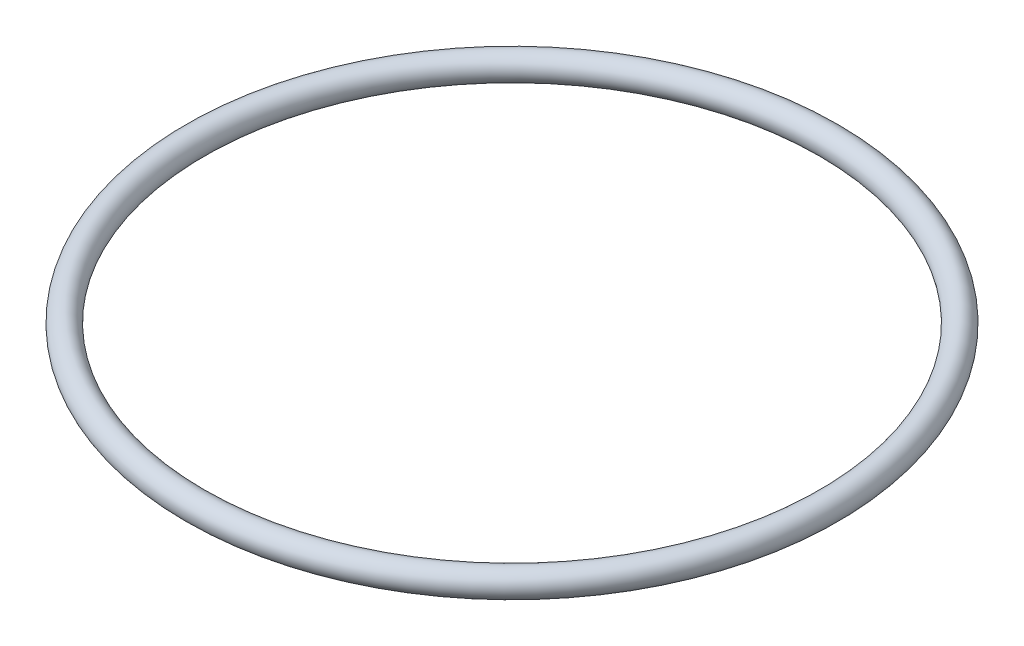
ISO-10303-21;
HEADER;
FILE_DESCRIPTION(('STEP AP214'),'2;1');
FILE_NAME('part.step','',(''),(''),'','','');
FILE_SCHEMA(('AUTOMOTIVE_DESIGN { 1 0 10303 214 1 1 1 1 }'));
ENDSEC;
DATA;
#1=APPLICATION_CONTEXT('core data for automotive mechanical design processes');
#2=APPLICATION_PROTOCOL_DEFINITION('international standard','automotive_design',2000,#1);
#3=PRODUCT_CONTEXT('',#1,'mechanical');
#4=PRODUCT('Part','Part','',(#3));
#5=PRODUCT_RELATED_PRODUCT_CATEGORY('part','',(#4));
#6=PRODUCT_DEFINITION_FORMATION('','',#4);
#7=PRODUCT_DEFINITION_CONTEXT('part definition',#1,'design');
#8=PRODUCT_DEFINITION('design','',#6,#7);
#9=PRODUCT_DEFINITION_SHAPE('','',#8);
#10=(LENGTH_UNIT() NAMED_UNIT(*) SI_UNIT(.MILLI.,.METRE.));
#11=(NAMED_UNIT(*) PLANE_ANGLE_UNIT() SI_UNIT($,.RADIAN.));
#12=(NAMED_UNIT(*) SI_UNIT($,.STERADIAN.) SOLID_ANGLE_UNIT());
#13=UNCERTAINTY_MEASURE_WITH_UNIT(LENGTH_MEASURE(1.E-05),#10,'distance_accuracy_value','');
#14=(GEOMETRIC_REPRESENTATION_CONTEXT(3) GLOBAL_UNCERTAINTY_ASSIGNED_CONTEXT((#13)) GLOBAL_UNIT_ASSIGNED_CONTEXT((#10,
#11,#12)) REPRESENTATION_CONTEXT('',''));
#15=CARTESIAN_POINT('',(0.,0.,0.));
#16=DIRECTION('',(0.,0.,1.));
#17=DIRECTION('',(1.,0.,0.));
#18=AXIS2_PLACEMENT_3D('',#15,#16,#17);
#19=CARTESIAN_POINT('',(0.,0.601464435146439,0.));
#20=DIRECTION('',(0.,-1.,0.));
#21=DIRECTION('',(0.,0.,-1.));
#22=AXIS2_PLACEMENT_3D('',#19,#20,#21);
#23=TOROIDAL_SURFACE('',#22,19.43,0.793749999999999);
#24=CARTESIAN_POINT('',(0.,0.601464435146439,-20.22375));
#25=VERTEX_POINT('',#24);
#26=VERTEX_LOOP('',#25);
#27=FACE_BOUND('',#26,.T.);
#28=ADVANCED_FACE('F32',(#27),#23,.T.);
#29=CLOSED_SHELL('',(#28));
#30=MANIFOLD_SOLID_BREP('B2',#29);
#31=ADVANCED_BREP_SHAPE_REPRESENTATION('',(#18,#30),#14);
#32=SHAPE_DEFINITION_REPRESENTATION(#9,#31);
ENDSEC;
END-ISO-10303-21;
